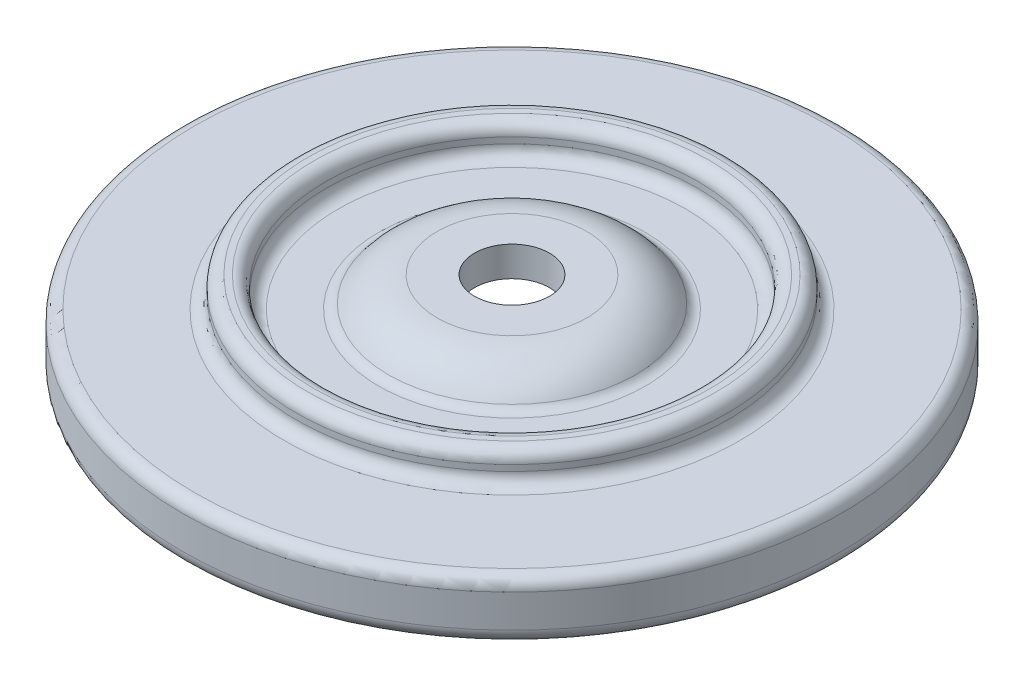
ISO-10303-21;
HEADER;
FILE_DESCRIPTION(('STEP AP214'),'2;1');
FILE_NAME('part.step','',(''),(''),'','','');
FILE_SCHEMA(('AUTOMOTIVE_DESIGN { 1 0 10303 214 1 1 1 1 }'));
ENDSEC;
DATA;
#1=APPLICATION_CONTEXT('core data for automotive mechanical design processes');
#2=APPLICATION_PROTOCOL_DEFINITION('international standard','automotive_design',2000,#1);
#3=PRODUCT_CONTEXT('',#1,'mechanical');
#4=PRODUCT('Part','Part','',(#3));
#5=PRODUCT_RELATED_PRODUCT_CATEGORY('part','',(#4));
#6=PRODUCT_DEFINITION_FORMATION('','',#4);
#7=PRODUCT_DEFINITION_CONTEXT('part definition',#1,'design');
#8=PRODUCT_DEFINITION('design','',#6,#7);
#9=PRODUCT_DEFINITION_SHAPE('','',#8);
#10=(LENGTH_UNIT() NAMED_UNIT(*) SI_UNIT(.MILLI.,.METRE.));
#11=(NAMED_UNIT(*) PLANE_ANGLE_UNIT() SI_UNIT($,.RADIAN.));
#12=(NAMED_UNIT(*) SI_UNIT($,.STERADIAN.) SOLID_ANGLE_UNIT());
#13=UNCERTAINTY_MEASURE_WITH_UNIT(LENGTH_MEASURE(1.E-05),#10,'distance_accuracy_value','');
#14=(GEOMETRIC_REPRESENTATION_CONTEXT(3) GLOBAL_UNCERTAINTY_ASSIGNED_CONTEXT((#13)) GLOBAL_UNIT_ASSIGNED_CONTEXT((#10,
#11,#12)) REPRESENTATION_CONTEXT('',''));
#15=CARTESIAN_POINT('',(0.,0.,0.));
#16=DIRECTION('',(0.,0.,1.));
#17=DIRECTION('',(1.,0.,0.));
#18=AXIS2_PLACEMENT_3D('',#15,#16,#17);
#19=CARTESIAN_POINT('',(13.97,-3.80999999999999,0.));
#20=DIRECTION('',(0.,1.,0.));
#21=DIRECTION('',(0.,0.,1.));
#22=AXIS2_PLACEMENT_3D('',#19,#20,#21);
#23=PLANE('',#22);
#24=CARTESIAN_POINT('',(0.,-3.80999999999999,0.));
#25=DIRECTION('',(0.,1.,0.));
#26=DIRECTION('',(0.,0.,1.));
#27=AXIS2_PLACEMENT_3D('',#24,#25,#26);
#28=CIRCLE('',#27,13.208);
#29=CARTESIAN_POINT('',(0.,-3.80999999999999,13.208));
#30=VERTEX_POINT('',#29);
#31=EDGE_CURVE('E88',#30,#30,#28,.T.);
#32=ORIENTED_EDGE('',*,*,#31,.T.);
#33=EDGE_LOOP('',(#32));
#34=FACE_BOUND('',#33,.T.);
#35=CARTESIAN_POINT('',(0.,-3.80999999999999,0.));
#36=DIRECTION('',(0.,1.,0.));
#37=DIRECTION('',(0.,0.,1.));
#38=AXIS2_PLACEMENT_3D('',#35,#36,#37);
#39=CIRCLE('',#38,13.335);
#40=CARTESIAN_POINT('',(0.,-3.80999999999999,13.335));
#41=VERTEX_POINT('',#40);
#42=EDGE_CURVE('E94',#41,#41,#39,.F.);
#43=ORIENTED_EDGE('',*,*,#42,.T.);
#44=EDGE_LOOP('',(#43));
#45=FACE_BOUND('',#44,.T.);
#46=ADVANCED_FACE('F32',(#34,#45),#23,.F.);
#47=CARTESIAN_POINT('',(0.,0.,0.));
#48=DIRECTION('',(0.,-1.,0.));
#49=DIRECTION('',(0.,0.,-1.));
#50=AXIS2_PLACEMENT_3D('',#47,#48,#49);
#51=PLANE('',#50);
#52=CARTESIAN_POINT('',(0.,0.,0.));
#53=DIRECTION('',(0.,-1.,0.));
#54=DIRECTION('',(0.,0.,-1.));
#55=AXIS2_PLACEMENT_3D('',#52,#53,#54);
#56=CIRCLE('',#55,8.636);
#57=CARTESIAN_POINT('',(0.,0.,-8.636));
#58=VERTEX_POINT('',#57);
#59=EDGE_CURVE('E55',#58,#58,#56,.F.);
#60=ORIENTED_EDGE('',*,*,#59,.T.);
#61=EDGE_LOOP('',(#60));
#62=FACE_BOUND('',#61,.T.);
#63=CARTESIAN_POINT('',(0.,0.,0.));
#64=DIRECTION('',(0.,-1.,0.));
#65=DIRECTION('',(0.,0.,-1.));
#66=AXIS2_PLACEMENT_3D('',#63,#64,#65);
#67=CIRCLE('',#66,8.382);
#68=CARTESIAN_POINT('',(0.,0.,-8.382));
#69=VERTEX_POINT('',#68);
#70=EDGE_CURVE('E58',#69,#69,#67,.T.);
#71=ORIENTED_EDGE('',*,*,#70,.T.);
#72=EDGE_LOOP('',(#71));
#73=FACE_BOUND('',#72,.T.);
#74=ADVANCED_FACE('F123',(#62,#73),#51,.F.);
#75=CARTESIAN_POINT('',(0.,0.,0.));
#76=DIRECTION('',(0.,-1.,0.));
#77=DIRECTION('',(0.,0.,-1.));
#78=AXIS2_PLACEMENT_3D('',#75,#76,#77);
#79=CYLINDRICAL_SURFACE('',#78,9.144);
#80=CARTESIAN_POINT('',(0.,-0.762,0.));
#81=DIRECTION('',(0.,-1.,0.));
#82=DIRECTION('',(0.,0.,-1.));
#83=AXIS2_PLACEMENT_3D('',#80,#81,#82);
#84=CIRCLE('',#83,9.144);
#85=CARTESIAN_POINT('',(0.,-0.762,-9.144));
#86=VERTEX_POINT('',#85);
#87=EDGE_CURVE('E64',#86,#86,#84,.F.);
#88=ORIENTED_EDGE('',*,*,#87,.T.);
#89=EDGE_LOOP('',(#88));
#90=FACE_BOUND('',#89,.T.);
#91=CARTESIAN_POINT('',(0.,-0.508,0.));
#92=DIRECTION('',(0.,-1.,0.));
#93=DIRECTION('',(0.,0.,-1.));
#94=AXIS2_PLACEMENT_3D('',#91,#92,#93);
#95=CIRCLE('',#94,9.144);
#96=CARTESIAN_POINT('',(0.,-0.508,-9.144));
#97=VERTEX_POINT('',#96);
#98=EDGE_CURVE('E67',#97,#97,#95,.T.);
#99=ORIENTED_EDGE('',*,*,#98,.T.);
#100=EDGE_LOOP('',(#99));
#101=FACE_BOUND('',#100,.T.);
#102=ADVANCED_FACE('F129',(#90,#101),#79,.T.);
#103=CARTESIAN_POINT('',(9.144,-1.27,0.));
#104=DIRECTION('',(0.,-1.,0.));
#105=DIRECTION('',(0.,0.,-1.));
#106=AXIS2_PLACEMENT_3D('',#103,#104,#105);
#107=PLANE('',#106);
#108=CARTESIAN_POINT('',(0.,-1.27,0.));
#109=DIRECTION('',(0.,-1.,0.));
#110=DIRECTION('',(0.,0.,-1.));
#111=AXIS2_PLACEMENT_3D('',#108,#109,#110);
#112=CIRCLE('',#111,9.652);
#113=CARTESIAN_POINT('',(0.,-1.27,-9.652));
#114=VERTEX_POINT('',#113);
#115=EDGE_CURVE('E70',#114,#114,#112,.T.);
#116=ORIENTED_EDGE('',*,*,#115,.T.);
#117=EDGE_LOOP('',(#116));
#118=FACE_BOUND('',#117,.T.);
#119=CARTESIAN_POINT('',(0.,-1.27,0.));
#120=DIRECTION('',(0.,-1.,0.));
#121=DIRECTION('',(0.,0.,-1.));
#122=AXIS2_PLACEMENT_3D('',#119,#120,#121);
#123=CIRCLE('',#122,13.462);
#124=CARTESIAN_POINT('',(0.,-1.27,-13.462));
#125=VERTEX_POINT('',#124);
#126=EDGE_CURVE('E73',#125,#125,#123,.F.);
#127=ORIENTED_EDGE('',*,*,#126,.T.);
#128=EDGE_LOOP('',(#127));
#129=FACE_BOUND('',#128,.T.);
#130=ADVANCED_FACE('F141',(#118,#129),#107,.F.);
#131=CARTESIAN_POINT('',(0.,0.,0.));
#132=DIRECTION('',(0.,-1.,0.));
#133=DIRECTION('',(0.,0.,-1.));
#134=AXIS2_PLACEMENT_3D('',#131,#132,#133);
#135=CYLINDRICAL_SURFACE('',#134,13.97);
#136=CARTESIAN_POINT('',(0.,-1.778,0.));
#137=DIRECTION('',(0.,-1.,0.));
#138=DIRECTION('',(0.,0.,-1.));
#139=AXIS2_PLACEMENT_3D('',#136,#137,#138);
#140=CIRCLE('',#139,13.97);
#141=CARTESIAN_POINT('',(0.,-1.778,-13.97));
#142=VERTEX_POINT('',#141);
#143=EDGE_CURVE('E61',#142,#142,#140,.T.);
#144=ORIENTED_EDGE('',*,*,#143,.T.);
#145=EDGE_LOOP('',(#144));
#146=FACE_BOUND('',#145,.T.);
#147=CARTESIAN_POINT('',(0.,-3.17499999999999,0.));
#148=DIRECTION('',(0.,1.,0.));
#149=DIRECTION('',(0.,0.,1.));
#150=AXIS2_PLACEMENT_3D('',#147,#148,#149);
#151=CIRCLE('',#150,13.97);
#152=CARTESIAN_POINT('',(0.,-3.17499999999999,13.97));
#153=VERTEX_POINT('',#152);
#154=EDGE_CURVE('E91',#153,#153,#151,.T.);
#155=ORIENTED_EDGE('',*,*,#154,.T.);
#156=EDGE_LOOP('',(#155));
#157=FACE_BOUND('',#156,.T.);
#158=ADVANCED_FACE('F138',(#146,#157),#135,.T.);
#159=CARTESIAN_POINT('',(0.,-2.54,0.));
#160=DIRECTION('',(0.,1.,0.));
#161=DIRECTION('',(0.,0.,1.));
#162=AXIS2_PLACEMENT_3D('',#159,#160,#161);
#163=TOROIDAL_SURFACE('',#162,3.175,2.54);
#164=CARTESIAN_POINT('',(0.,-1.05833333333333,0.));
#165=DIRECTION('',(0.,-1.,0.));
#166=DIRECTION('',(0.,0.,-1.));
#167=AXIS2_PLACEMENT_3D('',#164,#165,#166);
#168=CIRCLE('',#167,5.23807146965123);
#169=CARTESIAN_POINT('',(0.,-1.05833333333333,-5.23807146965123));
#170=VERTEX_POINT('',#169);
#171=EDGE_CURVE('E10',#170,#170,#168,.F.);
#172=ORIENTED_EDGE('',*,*,#171,.T.);
#173=EDGE_LOOP('',(#172));
#174=FACE_BOUND('',#173,.T.);
#175=CARTESIAN_POINT('',(0.,0.,0.));
#176=DIRECTION('',(0.,1.,0.));
#177=DIRECTION('',(0.,0.,1.));
#178=AXIS2_PLACEMENT_3D('',#175,#176,#177);
#179=CIRCLE('',#178,3.175);
#180=CARTESIAN_POINT('',(0.,0.,3.175));
#181=VERTEX_POINT('',#180);
#182=EDGE_CURVE('E97',#181,#181,#179,.T.);
#183=ORIENTED_EDGE('',*,*,#182,.F.);
#184=EDGE_LOOP('',(#183));
#185=FACE_BOUND('',#184,.T.);
#186=ADVANCED_FACE('F136',(#174,#185),#163,.T.);
#187=CARTESIAN_POINT('',(7.874,-1.27,0.));
#188=DIRECTION('',(0.,-1.,0.));
#189=DIRECTION('',(0.,0.,-1.));
#190=AXIS2_PLACEMENT_3D('',#187,#188,#189);
#191=PLANE('',#190);
#192=CARTESIAN_POINT('',(0.,-1.27,0.));
#193=DIRECTION('',(0.,-1.,0.));
#194=DIRECTION('',(0.,0.,-1.));
#195=AXIS2_PLACEMENT_3D('',#192,#193,#194);
#196=CIRCLE('',#195,7.366);
#197=CARTESIAN_POINT('',(0.,-1.27,-7.366));
#198=VERTEX_POINT('',#197);
#199=EDGE_CURVE('E40',#198,#198,#196,.F.);
#200=ORIENTED_EDGE('',*,*,#199,.T.);
#201=EDGE_LOOP('',(#200));
#202=FACE_BOUND('',#201,.T.);
#203=CARTESIAN_POINT('',(0.,-1.27,0.));
#204=DIRECTION('',(0.,-1.,0.));
#205=DIRECTION('',(0.,0.,-1.));
#206=AXIS2_PLACEMENT_3D('',#203,#204,#205);
#207=CIRCLE('',#206,5.65068576358148);
#208=CARTESIAN_POINT('',(0.,-1.27,-5.65068576358148));
#209=VERTEX_POINT('',#208);
#210=EDGE_CURVE('E44',#209,#209,#207,.T.);
#211=ORIENTED_EDGE('',*,*,#210,.T.);
#212=EDGE_LOOP('',(#211));
#213=FACE_BOUND('',#212,.T.);
#214=ADVANCED_FACE('F189',(#202,#213),#191,.F.);
#215=CARTESIAN_POINT('',(0.,0.,0.));
#216=DIRECTION('',(0.,1.,0.));
#217=DIRECTION('',(0.,0.,1.));
#218=AXIS2_PLACEMENT_3D('',#215,#216,#217);
#219=CYLINDRICAL_SURFACE('',#218,7.874);
#220=CARTESIAN_POINT('',(0.,-0.508,0.));
#221=DIRECTION('',(0.,-1.,0.));
#222=DIRECTION('',(0.,0.,-1.));
#223=AXIS2_PLACEMENT_3D('',#220,#221,#222);
#224=CIRCLE('',#223,7.874);
#225=CARTESIAN_POINT('',(0.,-0.508,-7.874));
#226=VERTEX_POINT('',#225);
#227=EDGE_CURVE('E49',#226,#226,#224,.F.);
#228=ORIENTED_EDGE('',*,*,#227,.T.);
#229=EDGE_LOOP('',(#228));
#230=FACE_BOUND('',#229,.T.);
#231=CARTESIAN_POINT('',(0.,-0.762,0.));
#232=DIRECTION('',(0.,-1.,0.));
#233=DIRECTION('',(0.,0.,-1.));
#234=AXIS2_PLACEMENT_3D('',#231,#232,#233);
#235=CIRCLE('',#234,7.874);
#236=CARTESIAN_POINT('',(0.,-0.762,-7.874));
#237=VERTEX_POINT('',#236);
#238=EDGE_CURVE('E52',#237,#237,#235,.T.);
#239=ORIENTED_EDGE('',*,*,#238,.T.);
#240=EDGE_LOOP('',(#239));
#241=FACE_BOUND('',#240,.T.);
#242=ADVANCED_FACE('F192',(#230,#241),#219,.F.);
#243=CARTESIAN_POINT('',(0.,0.,0.));
#244=DIRECTION('',(0.,1.,0.));
#245=DIRECTION('',(0.,0.,1.));
#246=AXIS2_PLACEMENT_3D('',#243,#244,#245);
#247=CIRCLE('',#246,1.5875);
#248=CARTESIAN_POINT('',(0.,0.,1.5875));
#249=VERTEX_POINT('',#248);
#250=EDGE_CURVE('E103',#249,#249,#247,.T.);
#251=ORIENTED_EDGE('',*,*,#250,.F.);
#252=EDGE_LOOP('',(#251));
#253=FACE_BOUND('',#252,.T.);
#254=ORIENTED_EDGE('',*,*,#182,.T.);
#255=EDGE_LOOP('',(#254));
#256=FACE_BOUND('',#255,.T.);
#257=ADVANCED_FACE('F132',(#253,#256),#51,.F.);
#258=CARTESIAN_POINT('',(0.,-1.27,0.));
#259=DIRECTION('',(0.,1.,0.));
#260=DIRECTION('',(0.,0.,1.));
#261=AXIS2_PLACEMENT_3D('',#258,#259,#260);
#262=PLANE('',#261);
#263=CARTESIAN_POINT('',(0.,-1.27,0.));
#264=DIRECTION('',(0.,1.,0.));
#265=DIRECTION('',(0.,0.,1.));
#266=AXIS2_PLACEMENT_3D('',#263,#264,#265);
#267=CIRCLE('',#266,1.5875);
#268=CARTESIAN_POINT('',(0.,-1.27,1.5875));
#269=VERTEX_POINT('',#268);
#270=EDGE_CURVE('E36',#269,#269,#267,.T.);
#271=ORIENTED_EDGE('',*,*,#270,.T.);
#272=EDGE_LOOP('',(#271));
#273=FACE_BOUND('',#272,.T.);
#274=CARTESIAN_POINT('',(0.,-1.27,0.));
#275=DIRECTION('',(0.,1.,0.));
#276=DIRECTION('',(0.,0.,1.));
#277=AXIS2_PLACEMENT_3D('',#274,#275,#276);
#278=CIRCLE('',#277,3.175);
#279=CARTESIAN_POINT('',(0.,-1.27,3.175));
#280=VERTEX_POINT('',#279);
#281=EDGE_CURVE('E100',#280,#280,#278,.T.);
#282=ORIENTED_EDGE('',*,*,#281,.F.);
#283=EDGE_LOOP('',(#282));
#284=FACE_BOUND('',#283,.T.);
#285=ADVANCED_FACE('F110',(#273,#284),#262,.F.);
#286=CARTESIAN_POINT('',(0.,-2.54,0.));
#287=DIRECTION('',(0.,1.,0.));
#288=DIRECTION('',(0.,0.,1.));
#289=AXIS2_PLACEMENT_3D('',#286,#287,#288);
#290=TOROIDAL_SURFACE('',#289,3.175,1.27);
#291=CARTESIAN_POINT('',(0.,-2.159,0.));
#292=DIRECTION('',(0.,-1.,0.));
#293=DIRECTION('',(0.,0.,-1.));
#294=AXIS2_PLACEMENT_3D('',#291,#292,#293);
#295=CIRCLE('',#294,4.38650278579952);
#296=CARTESIAN_POINT('',(0.,-2.159,-4.38650278579952));
#297=VERTEX_POINT('',#296);
#298=EDGE_CURVE('E76',#297,#297,#295,.T.);
#299=ORIENTED_EDGE('',*,*,#298,.T.);
#300=EDGE_LOOP('',(#299));
#301=FACE_BOUND('',#300,.T.);
#302=ORIENTED_EDGE('',*,*,#281,.T.);
#303=EDGE_LOOP('',(#302));
#304=FACE_BOUND('',#303,.T.);
#305=ADVANCED_FACE('F204',(#301,#304),#290,.F.);
#306=CARTESIAN_POINT('',(12.7,-3.048,0.));
#307=DIRECTION('',(0.,-1.,0.));
#308=DIRECTION('',(0.,0.,-1.));
#309=AXIS2_PLACEMENT_3D('',#306,#307,#308);
#310=PLANE('',#309);
#311=CARTESIAN_POINT('',(0.,-3.048,0.));
#312=DIRECTION('',(0.,-1.,0.));
#313=DIRECTION('',(0.,0.,-1.));
#314=AXIS2_PLACEMENT_3D('',#311,#312,#313);
#315=CIRCLE('',#314,5.59800557159904);
#316=CARTESIAN_POINT('',(0.,-3.048,-5.59800557159904));
#317=VERTEX_POINT('',#316);
#318=EDGE_CURVE('E79',#317,#317,#315,.F.);
#319=ORIENTED_EDGE('',*,*,#318,.T.);
#320=EDGE_LOOP('',(#319));
#321=FACE_BOUND('',#320,.T.);
#322=CARTESIAN_POINT('',(0.,-3.048,0.));
#323=DIRECTION('',(0.,-1.,0.));
#324=DIRECTION('',(0.,0.,-1.));
#325=AXIS2_PLACEMENT_3D('',#322,#323,#324);
#326=CIRCLE('',#325,12.2242622300633);
#327=CARTESIAN_POINT('',(0.,-3.048,-12.2242622300633));
#328=VERTEX_POINT('',#327);
#329=EDGE_CURVE('E82',#328,#328,#326,.T.);
#330=ORIENTED_EDGE('',*,*,#329,.T.);
#331=EDGE_LOOP('',(#330));
#332=FACE_BOUND('',#331,.T.);
#333=ADVANCED_FACE('F153',(#321,#332),#310,.T.);
#334=CARTESIAN_POINT('',(0.,-3.17499999999999,0.));
#335=DIRECTION('',(0.,1.,0.));
#336=DIRECTION('',(0.,0.,1.));
#337=AXIS2_PLACEMENT_3D('',#334,#335,#336);
#338=TOROIDAL_SURFACE('',#337,13.335,0.635);
#339=ORIENTED_EDGE('',*,*,#154,.F.);
#340=EDGE_LOOP('',(#339));
#341=FACE_BOUND('',#340,.T.);
#342=ORIENTED_EDGE('',*,*,#42,.F.);
#343=EDGE_LOOP('',(#342));
#344=FACE_BOUND('',#343,.T.);
#345=ADVANCED_FACE('F149',(#341,#344),#338,.T.);
#346=CARTESIAN_POINT('',(0.,-3.30199999999999,0.));
#347=DIRECTION('',(0.,1.,0.));
#348=DIRECTION('',(0.,0.,1.));
#349=AXIS2_PLACEMENT_3D('',#346,#347,#348);
#350=TOROIDAL_SURFACE('',#349,13.208,0.508);
#351=CARTESIAN_POINT('',(0.,-3.429,0.));
#352=DIRECTION('',(0.,1.,0.));
#353=DIRECTION('',(0.,0.,1.));
#354=AXIS2_PLACEMENT_3D('',#351,#352,#353);
#355=CIRCLE('',#354,12.7161311150316);
#356=CARTESIAN_POINT('',(0.,-3.429,12.7161311150316));
#357=VERTEX_POINT('',#356);
#358=EDGE_CURVE('E85',#357,#357,#355,.T.);
#359=ORIENTED_EDGE('',*,*,#358,.T.);
#360=EDGE_LOOP('',(#359));
#361=FACE_BOUND('',#360,.T.);
#362=ORIENTED_EDGE('',*,*,#31,.F.);
#363=EDGE_LOOP('',(#362));
#364=FACE_BOUND('',#363,.T.);
#365=ADVANCED_FACE('F152',(#361,#364),#350,.T.);
#366=CARTESIAN_POINT('',(0.,-3.556,0.));
#367=DIRECTION('',(0.,1.,0.));
#368=DIRECTION('',(0.,0.,1.));
#369=AXIS2_PLACEMENT_3D('',#366,#367,#368);
#370=TOROIDAL_SURFACE('',#369,12.2242622300633,0.508);
#371=ORIENTED_EDGE('',*,*,#329,.F.);
#372=EDGE_LOOP('',(#371));
#373=FACE_BOUND('',#372,.T.);
#374=ORIENTED_EDGE('',*,*,#358,.F.);
#375=EDGE_LOOP('',(#374));
#376=FACE_BOUND('',#375,.T.);
#377=ADVANCED_FACE('F157',(#373,#376),#370,.F.);
#378=CARTESIAN_POINT('',(0.,-1.778,0.));
#379=DIRECTION('',(0.,-1.,0.));
#380=DIRECTION('',(0.,0.,-1.));
#381=AXIS2_PLACEMENT_3D('',#378,#379,#380);
#382=TOROIDAL_SURFACE('',#381,5.59800557159904,1.27);
#383=ORIENTED_EDGE('',*,*,#298,.F.);
#384=EDGE_LOOP('',(#383));
#385=FACE_BOUND('',#384,.T.);
#386=ORIENTED_EDGE('',*,*,#318,.F.);
#387=EDGE_LOOP('',(#386));
#388=FACE_BOUND('',#387,.T.);
#389=ADVANCED_FACE('F161',(#385,#388),#382,.T.);
#390=CARTESIAN_POINT('',(0.,-0.762,0.));
#391=DIRECTION('',(0.,-1.,0.));
#392=DIRECTION('',(0.,0.,-1.));
#393=AXIS2_PLACEMENT_3D('',#390,#391,#392);
#394=TOROIDAL_SURFACE('',#393,9.652,0.508);
#395=ORIENTED_EDGE('',*,*,#87,.F.);
#396=EDGE_LOOP('',(#395));
#397=FACE_BOUND('',#396,.T.);
#398=ORIENTED_EDGE('',*,*,#115,.F.);
#399=EDGE_LOOP('',(#398));
#400=FACE_BOUND('',#399,.T.);
#401=ADVANCED_FACE('F165',(#397,#400),#394,.F.);
#402=CARTESIAN_POINT('',(0.,-1.778,0.));
#403=DIRECTION('',(0.,-1.,0.));
#404=DIRECTION('',(0.,0.,-1.));
#405=AXIS2_PLACEMENT_3D('',#402,#403,#404);
#406=TOROIDAL_SURFACE('',#405,13.462,0.508);
#407=ORIENTED_EDGE('',*,*,#126,.F.);
#408=EDGE_LOOP('',(#407));
#409=FACE_BOUND('',#408,.T.);
#410=ORIENTED_EDGE('',*,*,#143,.F.);
#411=EDGE_LOOP('',(#410));
#412=FACE_BOUND('',#411,.T.);
#413=ADVANCED_FACE('F169',(#409,#412),#406,.T.);
#414=CARTESIAN_POINT('',(0.,-0.508,0.));
#415=DIRECTION('',(0.,-1.,0.));
#416=DIRECTION('',(0.,0.,-1.));
#417=AXIS2_PLACEMENT_3D('',#414,#415,#416);
#418=TOROIDAL_SURFACE('',#417,8.636,0.508);
#419=ORIENTED_EDGE('',*,*,#59,.F.);
#420=EDGE_LOOP('',(#419));
#421=FACE_BOUND('',#420,.T.);
#422=ORIENTED_EDGE('',*,*,#98,.F.);
#423=EDGE_LOOP('',(#422));
#424=FACE_BOUND('',#423,.T.);
#425=ADVANCED_FACE('F173',(#421,#424),#418,.T.);
#426=CARTESIAN_POINT('',(0.,-0.508,0.));
#427=DIRECTION('',(0.,-1.,0.));
#428=DIRECTION('',(0.,0.,-1.));
#429=AXIS2_PLACEMENT_3D('',#426,#427,#428);
#430=TOROIDAL_SURFACE('',#429,8.382,0.508);
#431=ORIENTED_EDGE('',*,*,#70,.F.);
#432=EDGE_LOOP('',(#431));
#433=FACE_BOUND('',#432,.T.);
#434=ORIENTED_EDGE('',*,*,#227,.F.);
#435=EDGE_LOOP('',(#434));
#436=FACE_BOUND('',#435,.T.);
#437=ADVANCED_FACE('F177',(#433,#436),#430,.T.);
#438=CARTESIAN_POINT('',(0.,-0.762,0.));
#439=DIRECTION('',(0.,-1.,0.));
#440=DIRECTION('',(0.,0.,-1.));
#441=AXIS2_PLACEMENT_3D('',#438,#439,#440);
#442=TOROIDAL_SURFACE('',#441,7.366,0.508);
#443=ORIENTED_EDGE('',*,*,#238,.F.);
#444=EDGE_LOOP('',(#443));
#445=FACE_BOUND('',#444,.T.);
#446=ORIENTED_EDGE('',*,*,#199,.F.);
#447=EDGE_LOOP('',(#446));
#448=FACE_BOUND('',#447,.T.);
#449=ADVANCED_FACE('F119',(#445,#448),#442,.F.);
#450=CARTESIAN_POINT('',(0.,-0.762,0.));
#451=DIRECTION('',(0.,-1.,0.));
#452=DIRECTION('',(0.,0.,-1.));
#453=AXIS2_PLACEMENT_3D('',#450,#451,#452);
#454=TOROIDAL_SURFACE('',#453,5.65068576358148,0.508);
#455=ORIENTED_EDGE('',*,*,#210,.F.);
#456=EDGE_LOOP('',(#455));
#457=FACE_BOUND('',#456,.T.);
#458=ORIENTED_EDGE('',*,*,#171,.F.);
#459=EDGE_LOOP('',(#458));
#460=FACE_BOUND('',#459,.T.);
#461=ADVANCED_FACE('F34',(#457,#460),#454,.F.);
#462=CARTESIAN_POINT('',(0.,-3.80999999999999,0.));
#463=DIRECTION('',(0.,1.,0.));
#464=DIRECTION('',(0.,0.,1.));
#465=AXIS2_PLACEMENT_3D('',#462,#463,#464);
#466=CYLINDRICAL_SURFACE('',#465,1.5875);
#467=ORIENTED_EDGE('',*,*,#250,.T.);
#468=EDGE_LOOP('',(#467));
#469=FACE_BOUND('',#468,.T.);
#470=ORIENTED_EDGE('',*,*,#270,.F.);
#471=EDGE_LOOP('',(#470));
#472=FACE_BOUND('',#471,.T.);
#473=ADVANCED_FACE('F113',(#469,#472),#466,.F.);
#474=CLOSED_SHELL('',(#46,#74,#102,#130,#158,#186,#214,#242,#257,#285,#305,#333,#345,#365,#377,
#389,#401,#413,#425,#437,#449,#461,#473));
#475=MANIFOLD_SOLID_BREP('B2',#474);
#476=ADVANCED_BREP_SHAPE_REPRESENTATION('',(#18,#475),#14);
#477=SHAPE_DEFINITION_REPRESENTATION(#9,#476);
ENDSEC;
END-ISO-10303-21;
